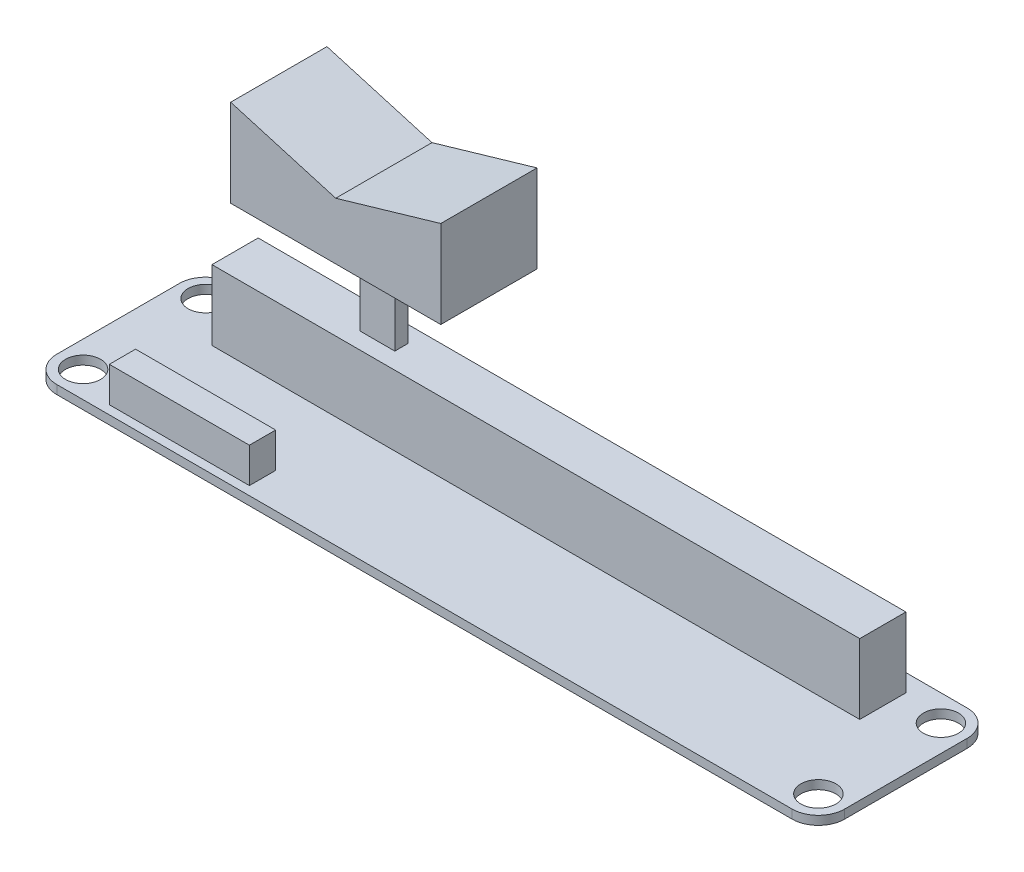
ISO-10303-21;
HEADER;
FILE_DESCRIPTION(('STEP AP214'),'2;1');
FILE_NAME('part.step','',(''),(''),'','','');
FILE_SCHEMA(('AUTOMOTIVE_DESIGN { 1 0 10303 214 1 1 1 1 }'));
ENDSEC;
DATA;
#1=APPLICATION_CONTEXT('core data for automotive mechanical design processes');
#2=APPLICATION_PROTOCOL_DEFINITION('international standard','automotive_design',2000,#1);
#3=PRODUCT_CONTEXT('',#1,'mechanical');
#4=PRODUCT('Part','Part','',(#3));
#5=PRODUCT_RELATED_PRODUCT_CATEGORY('part','',(#4));
#6=PRODUCT_DEFINITION_FORMATION('','',#4);
#7=PRODUCT_DEFINITION_CONTEXT('part definition',#1,'design');
#8=PRODUCT_DEFINITION('design','',#6,#7);
#9=PRODUCT_DEFINITION_SHAPE('','',#8);
#10=(LENGTH_UNIT() NAMED_UNIT(*) SI_UNIT(.MILLI.,.METRE.));
#11=(NAMED_UNIT(*) PLANE_ANGLE_UNIT() SI_UNIT($,.RADIAN.));
#12=(NAMED_UNIT(*) SI_UNIT($,.STERADIAN.) SOLID_ANGLE_UNIT());
#13=UNCERTAINTY_MEASURE_WITH_UNIT(LENGTH_MEASURE(1.E-05),#10,'distance_accuracy_value','');
#14=(GEOMETRIC_REPRESENTATION_CONTEXT(3) GLOBAL_UNCERTAINTY_ASSIGNED_CONTEXT((#13)) GLOBAL_UNIT_ASSIGNED_CONTEXT((#10,
#11,#12)) REPRESENTATION_CONTEXT('',''));
#15=CARTESIAN_POINT('',(0.,0.,0.));
#16=DIRECTION('',(0.,0.,1.));
#17=DIRECTION('',(1.,0.,0.));
#18=AXIS2_PLACEMENT_3D('',#15,#16,#17);
#19=CARTESIAN_POINT('',(0.,9.,0.));
#20=DIRECTION('',(0.,1.,0.));
#21=DIRECTION('',(0.,0.,1.));
#22=AXIS2_PLACEMENT_3D('',#19,#20,#21);
#23=PLANE('',#22);
#24=DIRECTION('',(0.,0.,1.));
#25=VECTOR('',#24,1.);
#26=CARTESIAN_POINT('',(8.,9.,-18.));
#27=LINE('',#26,#25);
#28=CARTESIAN_POINT('',(8.,9.,-18.));
#29=VERTEX_POINT('',#28);
#30=CARTESIAN_POINT('',(8.,9.,-12.7246609172367));
#31=VERTEX_POINT('',#30);
#32=EDGE_CURVE('E311',#29,#31,#27,.T.);
#33=ORIENTED_EDGE('',*,*,#32,.T.);
#34=DIRECTION('',(1.,0.,0.));
#35=VECTOR('',#34,1.);
#36=CARTESIAN_POINT('',(8.,9.,-12.7246609172367));
#37=LINE('',#36,#35);
#38=CARTESIAN_POINT('',(82.,9.,-12.7246609172367));
#39=VERTEX_POINT('',#38);
#40=EDGE_CURVE('E314',#31,#39,#37,.T.);
#41=ORIENTED_EDGE('',*,*,#40,.T.);
#42=DIRECTION('',(0.,0.,-1.));
#43=VECTOR('',#42,1.);
#44=CARTESIAN_POINT('',(82.,9.,-18.));
#45=LINE('',#44,#43);
#46=CARTESIAN_POINT('',(82.,9.,-18.));
#47=VERTEX_POINT('',#46);
#48=EDGE_CURVE('E317',#39,#47,#45,.T.);
#49=ORIENTED_EDGE('',*,*,#48,.T.);
#50=DIRECTION('',(-1.,0.,0.));
#51=VECTOR('',#50,1.);
#52=CARTESIAN_POINT('',(8.,9.,-18.));
#53=LINE('',#52,#51);
#54=EDGE_CURVE('E319',#47,#29,#53,.T.);
#55=ORIENTED_EDGE('',*,*,#54,.T.);
#56=EDGE_LOOP('',(#33,#41,#49,#55));
#57=FACE_BOUND('',#56,.T.);
#58=DIRECTION('',(1.,0.,0.));
#59=VECTOR('',#58,1.);
#60=CARTESIAN_POINT('',(23.,9.,-14.6123304586183));
#61=LINE('',#60,#59);
#62=CARTESIAN_POINT('',(23.,9.,-14.6123304586183));
#63=VERTEX_POINT('',#62);
#64=CARTESIAN_POINT('',(27.,9.,-14.6123304586183));
#65=VERTEX_POINT('',#64);
#66=EDGE_CURVE('E267',#63,#65,#61,.T.);
#67=ORIENTED_EDGE('',*,*,#66,.F.);
#68=DIRECTION('',(0.,0.,1.));
#69=VECTOR('',#68,1.);
#70=CARTESIAN_POINT('',(23.,9.,-16.1123304586183));
#71=LINE('',#70,#69);
#72=CARTESIAN_POINT('',(23.,9.,-16.1123304586183));
#73=VERTEX_POINT('',#72);
#74=EDGE_CURVE('E250',#73,#63,#71,.T.);
#75=ORIENTED_EDGE('',*,*,#74,.F.);
#76=DIRECTION('',(-1.,0.,0.));
#77=VECTOR('',#76,1.);
#78=CARTESIAN_POINT('',(23.,9.,-16.1123304586183));
#79=LINE('',#78,#77);
#80=CARTESIAN_POINT('',(27.,9.,-16.1123304586183));
#81=VERTEX_POINT('',#80);
#82=EDGE_CURVE('E255',#81,#73,#79,.T.);
#83=ORIENTED_EDGE('',*,*,#82,.F.);
#84=DIRECTION('',(0.,0.,-1.));
#85=VECTOR('',#84,1.);
#86=CARTESIAN_POINT('',(27.,9.,-16.1123304586183));
#87=LINE('',#86,#85);
#88=EDGE_CURVE('E269',#65,#81,#87,.T.);
#89=ORIENTED_EDGE('',*,*,#88,.F.);
#90=EDGE_LOOP('',(#67,#75,#83,#89));
#91=FACE_BOUND('',#90,.T.);
#92=ADVANCED_FACE('F35',(#57,#91),#23,.T.);
#93=CARTESIAN_POINT('',(0.,1.,0.));
#94=DIRECTION('',(0.,-1.,0.));
#95=DIRECTION('',(0.,0.,-1.));
#96=AXIS2_PLACEMENT_3D('',#93,#94,#95);
#97=PLANE('',#96);
#98=DIRECTION('',(0.,0.,1.));
#99=VECTOR('',#98,1.);
#100=CARTESIAN_POINT('',(8.,1.,-18.));
#101=LINE('',#100,#99);
#102=CARTESIAN_POINT('',(8.,1.,-18.));
#103=VERTEX_POINT('',#102);
#104=CARTESIAN_POINT('',(8.,1.,-12.7246609172367));
#105=VERTEX_POINT('',#104);
#106=EDGE_CURVE('E310',#103,#105,#101,.T.);
#107=ORIENTED_EDGE('',*,*,#106,.F.);
#108=DIRECTION('',(-1.,0.,0.));
#109=VECTOR('',#108,1.);
#110=CARTESIAN_POINT('',(8.,1.,-18.));
#111=LINE('',#110,#109);
#112=CARTESIAN_POINT('',(82.,1.,-18.));
#113=VERTEX_POINT('',#112);
#114=EDGE_CURVE('E315',#113,#103,#111,.T.);
#115=ORIENTED_EDGE('',*,*,#114,.F.);
#116=DIRECTION('',(0.,0.,-1.));
#117=VECTOR('',#116,1.);
#118=CARTESIAN_POINT('',(82.,1.,-18.));
#119=LINE('',#118,#117);
#120=CARTESIAN_POINT('',(82.,1.,-12.7246609172367));
#121=VERTEX_POINT('',#120);
#122=EDGE_CURVE('E327',#121,#113,#119,.T.);
#123=ORIENTED_EDGE('',*,*,#122,.F.);
#124=DIRECTION('',(1.,0.,0.));
#125=VECTOR('',#124,1.);
#126=CARTESIAN_POINT('',(8.,1.,-12.7246609172367));
#127=LINE('',#126,#125);
#128=EDGE_CURVE('E324',#105,#121,#127,.T.);
#129=ORIENTED_EDGE('',*,*,#128,.F.);
#130=EDGE_LOOP('',(#107,#115,#123,#129));
#131=FACE_BOUND('',#130,.T.);
#132=CARTESIAN_POINT('',(87.,1.,-16.9999999999999));
#133=DIRECTION('',(0.,1.,0.));
#134=DIRECTION('',(0.,0.,-1.));
#135=AXIS2_PLACEMENT_3D('',#132,#133,#134);
#136=CIRCLE('',#135,1.99999999999999);
#137=CARTESIAN_POINT('',(87.,1.,-18.9999999999999));
#138=VERTEX_POINT('',#137);
#139=EDGE_CURVE('E348',#138,#138,#136,.T.);
#140=ORIENTED_EDGE('',*,*,#139,.F.);
#141=EDGE_LOOP('',(#140));
#142=FACE_BOUND('',#141,.T.);
#143=CARTESIAN_POINT('',(87.,1.,-3.00000000000012));
#144=DIRECTION('',(0.,1.,0.));
#145=DIRECTION('',(0.,0.,1.));
#146=AXIS2_PLACEMENT_3D('',#143,#144,#145);
#147=CIRCLE('',#146,1.99999999999999);
#148=CARTESIAN_POINT('',(87.,1.,-1.00000000000013));
#149=VERTEX_POINT('',#148);
#150=EDGE_CURVE('E354',#149,#149,#147,.T.);
#151=ORIENTED_EDGE('',*,*,#150,.F.);
#152=EDGE_LOOP('',(#151));
#153=FACE_BOUND('',#152,.T.);
#154=CARTESIAN_POINT('',(3.,1.,-3.));
#155=DIRECTION('',(0.,1.,0.));
#156=DIRECTION('',(0.,0.,-1.));
#157=AXIS2_PLACEMENT_3D('',#154,#155,#156);
#158=CIRCLE('',#157,2.);
#159=CARTESIAN_POINT('',(3.,1.,-5.));
#160=VERTEX_POINT('',#159);
#161=EDGE_CURVE('E343',#160,#160,#158,.T.);
#162=ORIENTED_EDGE('',*,*,#161,.F.);
#163=EDGE_LOOP('',(#162));
#164=FACE_BOUND('',#163,.T.);
#165=CARTESIAN_POINT('',(3.,1.,-17.));
#166=DIRECTION('',(0.,1.,0.));
#167=DIRECTION('',(0.,0.,1.));
#168=AXIS2_PLACEMENT_3D('',#165,#166,#167);
#169=CIRCLE('',#168,2.);
#170=CARTESIAN_POINT('',(3.,1.,-15.));
#171=VERTEX_POINT('',#170);
#172=EDGE_CURVE('E347',#171,#171,#169,.T.);
#173=ORIENTED_EDGE('',*,*,#172,.F.);
#174=EDGE_LOOP('',(#173));
#175=FACE_BOUND('',#174,.T.);
#176=DIRECTION('',(0.,0.,-1.));
#177=VECTOR('',#176,1.);
#178=CARTESIAN_POINT('',(90.,1.,0.));
#179=LINE('',#178,#177);
#180=CARTESIAN_POINT('',(90.,1.,-3.));
#181=VERTEX_POINT('',#180);
#182=CARTESIAN_POINT('',(90.,1.,-17.));
#183=VERTEX_POINT('',#182);
#184=EDGE_CURVE('E375',#181,#183,#179,.T.);
#185=ORIENTED_EDGE('',*,*,#184,.T.);
#186=CARTESIAN_POINT('',(87.,1.,-17.));
#187=DIRECTION('',(0.,-1.,0.));
#188=DIRECTION('',(0.,0.,-1.));
#189=AXIS2_PLACEMENT_3D('',#186,#187,#188);
#190=CIRCLE('',#189,3.);
#191=CARTESIAN_POINT('',(87.,1.,-20.));
#192=VERTEX_POINT('',#191);
#193=EDGE_CURVE('E415',#183,#192,#190,.F.);
#194=ORIENTED_EDGE('',*,*,#193,.T.);
#195=DIRECTION('',(-1.,0.,0.));
#196=VECTOR('',#195,1.);
#197=CARTESIAN_POINT('',(0.,1.,-20.));
#198=LINE('',#197,#196);
#199=CARTESIAN_POINT('',(3.,1.,-20.));
#200=VERTEX_POINT('',#199);
#201=EDGE_CURVE('E378',#192,#200,#198,.T.);
#202=ORIENTED_EDGE('',*,*,#201,.T.);
#203=CARTESIAN_POINT('',(3.,1.,-17.));
#204=DIRECTION('',(0.,-1.,0.));
#205=DIRECTION('',(0.,0.,-1.));
#206=AXIS2_PLACEMENT_3D('',#203,#204,#205);
#207=CIRCLE('',#206,3.);
#208=CARTESIAN_POINT('',(0.,1.,-17.));
#209=VERTEX_POINT('',#208);
#210=EDGE_CURVE('E409',#200,#209,#207,.F.);
#211=ORIENTED_EDGE('',*,*,#210,.T.);
#212=DIRECTION('',(0.,0.,1.));
#213=VECTOR('',#212,1.);
#214=CARTESIAN_POINT('',(0.,1.,0.));
#215=LINE('',#214,#213);
#216=CARTESIAN_POINT('',(0.,1.,-3.));
#217=VERTEX_POINT('',#216);
#218=EDGE_CURVE('E368',#209,#217,#215,.T.);
#219=ORIENTED_EDGE('',*,*,#218,.T.);
#220=CARTESIAN_POINT('',(3.,1.,-3.));
#221=DIRECTION('',(0.,-1.,0.));
#222=DIRECTION('',(0.,0.,-1.));
#223=AXIS2_PLACEMENT_3D('',#220,#221,#222);
#224=CIRCLE('',#223,3.);
#225=CARTESIAN_POINT('',(3.,1.,0.));
#226=VERTEX_POINT('',#225);
#227=EDGE_CURVE('E411',#217,#226,#224,.F.);
#228=ORIENTED_EDGE('',*,*,#227,.T.);
#229=DIRECTION('',(1.,0.,0.));
#230=VECTOR('',#229,1.);
#231=CARTESIAN_POINT('',(0.,1.,0.));
#232=LINE('',#231,#230);
#233=CARTESIAN_POINT('',(87.,1.,0.));
#234=VERTEX_POINT('',#233);
#235=EDGE_CURVE('E371',#226,#234,#232,.T.);
#236=ORIENTED_EDGE('',*,*,#235,.T.);
#237=CARTESIAN_POINT('',(87.,1.,-3.));
#238=DIRECTION('',(0.,-1.,0.));
#239=DIRECTION('',(0.,0.,-1.));
#240=AXIS2_PLACEMENT_3D('',#237,#238,#239);
#241=CIRCLE('',#240,3.);
#242=EDGE_CURVE('E413',#234,#181,#241,.F.);
#243=ORIENTED_EDGE('',*,*,#242,.T.);
#244=EDGE_LOOP('',(#185,#194,#202,#211,#219,#228,#236,#243));
#245=FACE_BOUND('',#244,.T.);
#246=DIRECTION('',(0.,0.,1.));
#247=VECTOR('',#246,1.);
#248=CARTESIAN_POINT('',(8.,1.,-4.));
#249=LINE('',#248,#247);
#250=CARTESIAN_POINT('',(8.,1.,-4.));
#251=VERTEX_POINT('',#250);
#252=CARTESIAN_POINT('',(8.,1.,-1.));
#253=VERTEX_POINT('',#252);
#254=EDGE_CURVE('E280',#251,#253,#249,.T.);
#255=ORIENTED_EDGE('',*,*,#254,.F.);
#256=DIRECTION('',(-1.,0.,0.));
#257=VECTOR('',#256,1.);
#258=CARTESIAN_POINT('',(8.,1.,-4.));
#259=LINE('',#258,#257);
#260=CARTESIAN_POINT('',(24.,1.,-4.));
#261=VERTEX_POINT('',#260);
#262=EDGE_CURVE('E285',#261,#251,#259,.T.);
#263=ORIENTED_EDGE('',*,*,#262,.F.);
#264=DIRECTION('',(0.,0.,-1.));
#265=VECTOR('',#264,1.);
#266=CARTESIAN_POINT('',(24.,1.,-4.));
#267=LINE('',#266,#265);
#268=CARTESIAN_POINT('',(24.,1.,-1.));
#269=VERTEX_POINT('',#268);
#270=EDGE_CURVE('E295',#269,#261,#267,.T.);
#271=ORIENTED_EDGE('',*,*,#270,.F.);
#272=DIRECTION('',(1.,0.,0.));
#273=VECTOR('',#272,1.);
#274=CARTESIAN_POINT('',(8.,1.,-1.));
#275=LINE('',#274,#273);
#276=EDGE_CURVE('E58',#253,#269,#275,.T.);
#277=ORIENTED_EDGE('',*,*,#276,.F.);
#278=EDGE_LOOP('',(#255,#263,#271,#277));
#279=FACE_BOUND('',#278,.T.);
#280=ADVANCED_FACE('F444',(#131,#142,#153,#164,#175,#245,#279),#97,.F.);
#281=CARTESIAN_POINT('',(0.,1.,0.));
#282=DIRECTION('',(1.,0.,0.));
#283=DIRECTION('',(0.,0.,-1.));
#284=AXIS2_PLACEMENT_3D('',#281,#282,#283);
#285=PLANE('',#284);
#286=DIRECTION('',(0.,0.,1.));
#287=VECTOR('',#286,1.);
#288=CARTESIAN_POINT('',(0.,0.,0.));
#289=LINE('',#288,#287);
#290=CARTESIAN_POINT('',(0.,0.,-17.));
#291=VERTEX_POINT('',#290);
#292=CARTESIAN_POINT('',(0.,0.,-3.));
#293=VERTEX_POINT('',#292);
#294=EDGE_CURVE('E365',#291,#293,#289,.T.);
#295=ORIENTED_EDGE('',*,*,#294,.T.);
#296=DIRECTION('',(0.,-1.,0.));
#297=VECTOR('',#296,1.);
#298=CARTESIAN_POINT('',(0.,1.,-3.));
#299=LINE('',#298,#297);
#300=EDGE_CURVE('E11',#293,#217,#299,.F.);
#301=ORIENTED_EDGE('',*,*,#300,.T.);
#302=ORIENTED_EDGE('',*,*,#218,.F.);
#303=DIRECTION('',(0.,-1.,0.));
#304=VECTOR('',#303,1.);
#305=CARTESIAN_POINT('',(0.,1.,-17.));
#306=LINE('',#305,#304);
#307=EDGE_CURVE('E43',#209,#291,#306,.T.);
#308=ORIENTED_EDGE('',*,*,#307,.T.);
#309=EDGE_LOOP('',(#295,#301,#302,#308));
#310=FACE_BOUND('',#309,.T.);
#311=ADVANCED_FACE('F426',(#310),#285,.F.);
#312=CARTESIAN_POINT('',(0.,1.,0.));
#313=DIRECTION('',(0.,0.,-1.));
#314=DIRECTION('',(-1.,0.,0.));
#315=AXIS2_PLACEMENT_3D('',#312,#313,#314);
#316=PLANE('',#315);
#317=DIRECTION('',(1.,0.,0.));
#318=VECTOR('',#317,1.);
#319=CARTESIAN_POINT('',(0.,0.,0.));
#320=LINE('',#319,#318);
#321=CARTESIAN_POINT('',(3.,0.,0.));
#322=VERTEX_POINT('',#321);
#323=CARTESIAN_POINT('',(87.,0.,0.));
#324=VERTEX_POINT('',#323);
#325=EDGE_CURVE('E384',#322,#324,#320,.T.);
#326=ORIENTED_EDGE('',*,*,#325,.T.);
#327=DIRECTION('',(0.,-1.,0.));
#328=VECTOR('',#327,1.);
#329=CARTESIAN_POINT('',(87.,1.,0.));
#330=LINE('',#329,#328);
#331=EDGE_CURVE('E420',#324,#234,#330,.F.);
#332=ORIENTED_EDGE('',*,*,#331,.T.);
#333=ORIENTED_EDGE('',*,*,#235,.F.);
#334=DIRECTION('',(0.,-1.,0.));
#335=VECTOR('',#334,1.);
#336=CARTESIAN_POINT('',(3.,1.,0.));
#337=LINE('',#336,#335);
#338=EDGE_CURVE('E417',#226,#322,#337,.T.);
#339=ORIENTED_EDGE('',*,*,#338,.T.);
#340=EDGE_LOOP('',(#326,#332,#333,#339));
#341=FACE_BOUND('',#340,.T.);
#342=ADVANCED_FACE('F440',(#341),#316,.F.);
#343=CARTESIAN_POINT('',(90.,1.,0.));
#344=DIRECTION('',(-1.,0.,0.));
#345=DIRECTION('',(0.,0.,1.));
#346=AXIS2_PLACEMENT_3D('',#343,#344,#345);
#347=PLANE('',#346);
#348=DIRECTION('',(0.,0.,-1.));
#349=VECTOR('',#348,1.);
#350=CARTESIAN_POINT('',(90.,0.,0.));
#351=LINE('',#350,#349);
#352=CARTESIAN_POINT('',(90.,0.,-3.));
#353=VERTEX_POINT('',#352);
#354=CARTESIAN_POINT('',(90.,0.,-17.));
#355=VERTEX_POINT('',#354);
#356=EDGE_CURVE('E387',#353,#355,#351,.T.);
#357=ORIENTED_EDGE('',*,*,#356,.T.);
#358=DIRECTION('',(0.,-1.,0.));
#359=VECTOR('',#358,1.);
#360=CARTESIAN_POINT('',(90.,1.,-17.));
#361=LINE('',#360,#359);
#362=EDGE_CURVE('E407',#355,#183,#361,.F.);
#363=ORIENTED_EDGE('',*,*,#362,.T.);
#364=ORIENTED_EDGE('',*,*,#184,.F.);
#365=DIRECTION('',(0.,-1.,0.));
#366=VECTOR('',#365,1.);
#367=CARTESIAN_POINT('',(90.,1.,-3.));
#368=LINE('',#367,#366);
#369=EDGE_CURVE('E404',#181,#353,#368,.T.);
#370=ORIENTED_EDGE('',*,*,#369,.T.);
#371=EDGE_LOOP('',(#357,#363,#364,#370));
#372=FACE_BOUND('',#371,.T.);
#373=ADVANCED_FACE('F451',(#372),#347,.F.);
#374=CARTESIAN_POINT('',(0.,1.,-20.));
#375=DIRECTION('',(0.,0.,1.));
#376=DIRECTION('',(1.,0.,0.));
#377=AXIS2_PLACEMENT_3D('',#374,#375,#376);
#378=PLANE('',#377);
#379=ORIENTED_EDGE('',*,*,#201,.F.);
#380=DIRECTION('',(0.,-1.,0.));
#381=VECTOR('',#380,1.);
#382=CARTESIAN_POINT('',(87.,1.,-20.));
#383=LINE('',#382,#381);
#384=CARTESIAN_POINT('',(87.,0.,-20.));
#385=VERTEX_POINT('',#384);
#386=EDGE_CURVE('E393',#192,#385,#383,.T.);
#387=ORIENTED_EDGE('',*,*,#386,.T.);
#388=DIRECTION('',(-1.,0.,0.));
#389=VECTOR('',#388,1.);
#390=CARTESIAN_POINT('',(0.,0.,-20.));
#391=LINE('',#390,#389);
#392=CARTESIAN_POINT('',(3.,0.,-20.));
#393=VERTEX_POINT('',#392);
#394=EDGE_CURVE('E372',#385,#393,#391,.T.);
#395=ORIENTED_EDGE('',*,*,#394,.T.);
#396=DIRECTION('',(0.,-1.,0.));
#397=VECTOR('',#396,1.);
#398=CARTESIAN_POINT('',(3.,1.,-20.));
#399=LINE('',#398,#397);
#400=EDGE_CURVE('E381',#393,#200,#399,.F.);
#401=ORIENTED_EDGE('',*,*,#400,.T.);
#402=EDGE_LOOP('',(#379,#387,#395,#401));
#403=FACE_BOUND('',#402,.T.);
#404=ADVANCED_FACE('F459',(#403),#378,.F.);
#405=CARTESIAN_POINT('',(0.,0.,0.));
#406=DIRECTION('',(0.,-1.,0.));
#407=DIRECTION('',(0.,0.,-1.));
#408=AXIS2_PLACEMENT_3D('',#405,#406,#407);
#409=PLANE('',#408);
#410=CARTESIAN_POINT('',(87.,0.,-16.9999999999999));
#411=DIRECTION('',(0.,1.,0.));
#412=DIRECTION('',(0.,0.,-1.));
#413=AXIS2_PLACEMENT_3D('',#410,#411,#412);
#414=CIRCLE('',#413,1.99999999999999);
#415=CARTESIAN_POINT('',(87.,0.,-18.9999999999999));
#416=VERTEX_POINT('',#415);
#417=EDGE_CURVE('E344',#416,#416,#414,.T.);
#418=ORIENTED_EDGE('',*,*,#417,.T.);
#419=EDGE_LOOP('',(#418));
#420=FACE_BOUND('',#419,.T.);
#421=CARTESIAN_POINT('',(87.,0.,-3.00000000000012));
#422=DIRECTION('',(0.,1.,0.));
#423=DIRECTION('',(0.,0.,1.));
#424=AXIS2_PLACEMENT_3D('',#421,#422,#423);
#425=CIRCLE('',#424,1.99999999999999);
#426=CARTESIAN_POINT('',(87.,0.,-1.00000000000013));
#427=VERTEX_POINT('',#426);
#428=EDGE_CURVE('E351',#427,#427,#425,.T.);
#429=ORIENTED_EDGE('',*,*,#428,.T.);
#430=EDGE_LOOP('',(#429));
#431=FACE_BOUND('',#430,.T.);
#432=CARTESIAN_POINT('',(3.,0.,-3.));
#433=DIRECTION('',(0.,1.,0.));
#434=DIRECTION('',(0.,0.,-1.));
#435=AXIS2_PLACEMENT_3D('',#432,#433,#434);
#436=CIRCLE('',#435,2.);
#437=CARTESIAN_POINT('',(3.,0.,-5.));
#438=VERTEX_POINT('',#437);
#439=EDGE_CURVE('E357',#438,#438,#436,.T.);
#440=ORIENTED_EDGE('',*,*,#439,.T.);
#441=EDGE_LOOP('',(#440));
#442=FACE_BOUND('',#441,.T.);
#443=CARTESIAN_POINT('',(3.,0.,-17.));
#444=DIRECTION('',(0.,1.,0.));
#445=DIRECTION('',(0.,0.,1.));
#446=AXIS2_PLACEMENT_3D('',#443,#444,#445);
#447=CIRCLE('',#446,2.);
#448=CARTESIAN_POINT('',(3.,0.,-15.));
#449=VERTEX_POINT('',#448);
#450=EDGE_CURVE('E362',#449,#449,#447,.T.);
#451=ORIENTED_EDGE('',*,*,#450,.T.);
#452=EDGE_LOOP('',(#451));
#453=FACE_BOUND('',#452,.T.);
#454=ORIENTED_EDGE('',*,*,#394,.F.);
#455=CARTESIAN_POINT('',(87.,0.,-17.));
#456=DIRECTION('',(0.,-1.,0.));
#457=DIRECTION('',(0.,0.,-1.));
#458=AXIS2_PLACEMENT_3D('',#455,#456,#457);
#459=CIRCLE('',#458,3.);
#460=EDGE_CURVE('E402',#385,#355,#459,.T.);
#461=ORIENTED_EDGE('',*,*,#460,.T.);
#462=ORIENTED_EDGE('',*,*,#356,.F.);
#463=CARTESIAN_POINT('',(87.,0.,-3.));
#464=DIRECTION('',(0.,-1.,0.));
#465=DIRECTION('',(0.,0.,-1.));
#466=AXIS2_PLACEMENT_3D('',#463,#464,#465);
#467=CIRCLE('',#466,3.);
#468=EDGE_CURVE('E400',#353,#324,#467,.T.);
#469=ORIENTED_EDGE('',*,*,#468,.T.);
#470=ORIENTED_EDGE('',*,*,#325,.F.);
#471=CARTESIAN_POINT('',(3.,0.,-3.));
#472=DIRECTION('',(0.,-1.,0.));
#473=DIRECTION('',(0.,0.,-1.));
#474=AXIS2_PLACEMENT_3D('',#471,#472,#473);
#475=CIRCLE('',#474,3.);
#476=EDGE_CURVE('E398',#322,#293,#475,.T.);
#477=ORIENTED_EDGE('',*,*,#476,.T.);
#478=ORIENTED_EDGE('',*,*,#294,.F.);
#479=CARTESIAN_POINT('',(3.,0.,-17.));
#480=DIRECTION('',(0.,-1.,0.));
#481=DIRECTION('',(0.,0.,-1.));
#482=AXIS2_PLACEMENT_3D('',#479,#480,#481);
#483=CIRCLE('',#482,3.);
#484=EDGE_CURVE('E396',#291,#393,#483,.T.);
#485=ORIENTED_EDGE('',*,*,#484,.T.);
#486=EDGE_LOOP('',(#454,#461,#462,#469,#470,#477,#478,#485));
#487=FACE_BOUND('',#486,.T.);
#488=ADVANCED_FACE('F432',(#420,#431,#442,#453,#487),#409,.T.);
#489=CARTESIAN_POINT('',(3.,0.,-17.));
#490=DIRECTION('',(0.,1.,0.));
#491=DIRECTION('',(0.,0.,1.));
#492=AXIS2_PLACEMENT_3D('',#489,#490,#491);
#493=CYLINDRICAL_SURFACE('',#492,2.);
#494=ORIENTED_EDGE('',*,*,#450,.F.);
#495=EDGE_LOOP('',(#494));
#496=FACE_BOUND('',#495,.T.);
#497=ORIENTED_EDGE('',*,*,#172,.T.);
#498=EDGE_LOOP('',(#497));
#499=FACE_BOUND('',#498,.T.);
#500=ADVANCED_FACE('F505',(#496,#499),#493,.F.);
#501=CARTESIAN_POINT('',(3.,0.,-3.));
#502=DIRECTION('',(0.,1.,0.));
#503=DIRECTION('',(0.,0.,1.));
#504=AXIS2_PLACEMENT_3D('',#501,#502,#503);
#505=CYLINDRICAL_SURFACE('',#504,2.);
#506=ORIENTED_EDGE('',*,*,#439,.F.);
#507=EDGE_LOOP('',(#506));
#508=FACE_BOUND('',#507,.T.);
#509=ORIENTED_EDGE('',*,*,#161,.T.);
#510=EDGE_LOOP('',(#509));
#511=FACE_BOUND('',#510,.T.);
#512=ADVANCED_FACE('F501',(#508,#511),#505,.F.);
#513=CARTESIAN_POINT('',(87.,0.,-3.00000000000012));
#514=DIRECTION('',(0.,1.,0.));
#515=DIRECTION('',(0.,0.,1.));
#516=AXIS2_PLACEMENT_3D('',#513,#514,#515);
#517=CYLINDRICAL_SURFACE('',#516,1.99999999999999);
#518=ORIENTED_EDGE('',*,*,#428,.F.);
#519=EDGE_LOOP('',(#518));
#520=FACE_BOUND('',#519,.T.);
#521=ORIENTED_EDGE('',*,*,#150,.T.);
#522=EDGE_LOOP('',(#521));
#523=FACE_BOUND('',#522,.T.);
#524=ADVANCED_FACE('F497',(#520,#523),#517,.F.);
#525=CARTESIAN_POINT('',(87.,0.,-16.9999999999999));
#526=DIRECTION('',(0.,1.,0.));
#527=DIRECTION('',(0.,0.,1.));
#528=AXIS2_PLACEMENT_3D('',#525,#526,#527);
#529=CYLINDRICAL_SURFACE('',#528,1.99999999999999);
#530=ORIENTED_EDGE('',*,*,#417,.F.);
#531=EDGE_LOOP('',(#530));
#532=FACE_BOUND('',#531,.T.);
#533=ORIENTED_EDGE('',*,*,#139,.T.);
#534=EDGE_LOOP('',(#533));
#535=FACE_BOUND('',#534,.T.);
#536=ADVANCED_FACE('F494',(#532,#535),#529,.F.);
#537=CARTESIAN_POINT('',(87.,1.,-17.));
#538=DIRECTION('',(0.,-1.,0.));
#539=DIRECTION('',(0.,0.,-1.));
#540=AXIS2_PLACEMENT_3D('',#537,#538,#539);
#541=CYLINDRICAL_SURFACE('',#540,3.);
#542=ORIENTED_EDGE('',*,*,#193,.F.);
#543=ORIENTED_EDGE('',*,*,#362,.F.);
#544=ORIENTED_EDGE('',*,*,#460,.F.);
#545=ORIENTED_EDGE('',*,*,#386,.F.);
#546=EDGE_LOOP('',(#542,#543,#544,#545));
#547=FACE_BOUND('',#546,.T.);
#548=ADVANCED_FACE('F456',(#547),#541,.T.);
#549=CARTESIAN_POINT('',(87.,1.,-3.));
#550=DIRECTION('',(0.,-1.,0.));
#551=DIRECTION('',(0.,0.,-1.));
#552=AXIS2_PLACEMENT_3D('',#549,#550,#551);
#553=CYLINDRICAL_SURFACE('',#552,3.);
#554=ORIENTED_EDGE('',*,*,#242,.F.);
#555=ORIENTED_EDGE('',*,*,#331,.F.);
#556=ORIENTED_EDGE('',*,*,#468,.F.);
#557=ORIENTED_EDGE('',*,*,#369,.F.);
#558=EDGE_LOOP('',(#554,#555,#556,#557));
#559=FACE_BOUND('',#558,.T.);
#560=ADVANCED_FACE('F448',(#559),#553,.T.);
#561=CARTESIAN_POINT('',(3.,1.,-3.));
#562=DIRECTION('',(0.,-1.,0.));
#563=DIRECTION('',(0.,0.,-1.));
#564=AXIS2_PLACEMENT_3D('',#561,#562,#563);
#565=CYLINDRICAL_SURFACE('',#564,3.);
#566=ORIENTED_EDGE('',*,*,#227,.F.);
#567=ORIENTED_EDGE('',*,*,#300,.F.);
#568=ORIENTED_EDGE('',*,*,#476,.F.);
#569=ORIENTED_EDGE('',*,*,#338,.F.);
#570=EDGE_LOOP('',(#566,#567,#568,#569));
#571=FACE_BOUND('',#570,.T.);
#572=ADVANCED_FACE('F437',(#571),#565,.T.);
#573=CARTESIAN_POINT('',(3.,1.,-17.));
#574=DIRECTION('',(0.,-1.,0.));
#575=DIRECTION('',(0.,0.,-1.));
#576=AXIS2_PLACEMENT_3D('',#573,#574,#575);
#577=CYLINDRICAL_SURFACE('',#576,3.);
#578=ORIENTED_EDGE('',*,*,#210,.F.);
#579=ORIENTED_EDGE('',*,*,#400,.F.);
#580=ORIENTED_EDGE('',*,*,#484,.F.);
#581=ORIENTED_EDGE('',*,*,#307,.F.);
#582=EDGE_LOOP('',(#578,#579,#580,#581));
#583=FACE_BOUND('',#582,.T.);
#584=ADVANCED_FACE('F37',(#583),#577,.T.);
#585=CARTESIAN_POINT('',(8.,9.,-18.));
#586=DIRECTION('',(1.,0.,0.));
#587=DIRECTION('',(0.,0.,-1.));
#588=AXIS2_PLACEMENT_3D('',#585,#586,#587);
#589=PLANE('',#588);
#590=ORIENTED_EDGE('',*,*,#106,.T.);
#591=DIRECTION('',(0.,-1.,0.));
#592=VECTOR('',#591,1.);
#593=CARTESIAN_POINT('',(8.,9.,-12.7246609172367));
#594=LINE('',#593,#592);
#595=EDGE_CURVE('E340',#31,#105,#594,.T.);
#596=ORIENTED_EDGE('',*,*,#595,.F.);
#597=ORIENTED_EDGE('',*,*,#32,.F.);
#598=DIRECTION('',(0.,-1.,0.));
#599=VECTOR('',#598,1.);
#600=CARTESIAN_POINT('',(8.,9.,-18.));
#601=LINE('',#600,#599);
#602=EDGE_CURVE('E321',#29,#103,#601,.T.);
#603=ORIENTED_EDGE('',*,*,#602,.T.);
#604=EDGE_LOOP('',(#590,#596,#597,#603));
#605=FACE_BOUND('',#604,.T.);
#606=ADVANCED_FACE('F462',(#605),#589,.F.);
#607=CARTESIAN_POINT('',(8.,9.,-12.7246609172367));
#608=DIRECTION('',(0.,0.,-1.));
#609=DIRECTION('',(-1.,0.,0.));
#610=AXIS2_PLACEMENT_3D('',#607,#608,#609);
#611=PLANE('',#610);
#612=ORIENTED_EDGE('',*,*,#128,.T.);
#613=DIRECTION('',(0.,-1.,0.));
#614=VECTOR('',#613,1.);
#615=CARTESIAN_POINT('',(82.,9.,-12.7246609172367));
#616=LINE('',#615,#614);
#617=EDGE_CURVE('E337',#39,#121,#616,.T.);
#618=ORIENTED_EDGE('',*,*,#617,.F.);
#619=ORIENTED_EDGE('',*,*,#40,.F.);
#620=ORIENTED_EDGE('',*,*,#595,.T.);
#621=EDGE_LOOP('',(#612,#618,#619,#620));
#622=FACE_BOUND('',#621,.T.);
#623=ADVANCED_FACE('F467',(#622),#611,.F.);
#624=CARTESIAN_POINT('',(82.,9.,-18.));
#625=DIRECTION('',(-1.,0.,0.));
#626=DIRECTION('',(0.,0.,1.));
#627=AXIS2_PLACEMENT_3D('',#624,#625,#626);
#628=PLANE('',#627);
#629=ORIENTED_EDGE('',*,*,#122,.T.);
#630=DIRECTION('',(0.,-1.,0.));
#631=VECTOR('',#630,1.);
#632=CARTESIAN_POINT('',(82.,9.,-18.));
#633=LINE('',#632,#631);
#634=EDGE_CURVE('E334',#47,#113,#633,.T.);
#635=ORIENTED_EDGE('',*,*,#634,.F.);
#636=ORIENTED_EDGE('',*,*,#48,.F.);
#637=ORIENTED_EDGE('',*,*,#617,.T.);
#638=EDGE_LOOP('',(#629,#635,#636,#637));
#639=FACE_BOUND('',#638,.T.);
#640=ADVANCED_FACE('F486',(#639),#628,.F.);
#641=CARTESIAN_POINT('',(8.,9.,-18.));
#642=DIRECTION('',(0.,0.,1.));
#643=DIRECTION('',(1.,0.,0.));
#644=AXIS2_PLACEMENT_3D('',#641,#642,#643);
#645=PLANE('',#644);
#646=ORIENTED_EDGE('',*,*,#114,.T.);
#647=ORIENTED_EDGE('',*,*,#602,.F.);
#648=ORIENTED_EDGE('',*,*,#54,.F.);
#649=ORIENTED_EDGE('',*,*,#634,.T.);
#650=EDGE_LOOP('',(#646,#647,#648,#649));
#651=FACE_BOUND('',#650,.T.);
#652=ADVANCED_FACE('F483',(#651),#645,.F.);
#653=CARTESIAN_POINT('',(8.,5.,-4.));
#654=DIRECTION('',(1.,0.,0.));
#655=DIRECTION('',(0.,0.,-1.));
#656=AXIS2_PLACEMENT_3D('',#653,#654,#655);
#657=PLANE('',#656);
#658=ORIENTED_EDGE('',*,*,#254,.T.);
#659=DIRECTION('',(0.,-1.,0.));
#660=VECTOR('',#659,1.);
#661=CARTESIAN_POINT('',(8.,5.,-1.));
#662=LINE('',#661,#660);
#663=CARTESIAN_POINT('',(8.,5.,-1.));
#664=VERTEX_POINT('',#663);
#665=EDGE_CURVE('E308',#664,#253,#662,.T.);
#666=ORIENTED_EDGE('',*,*,#665,.F.);
#667=DIRECTION('',(0.,0.,1.));
#668=VECTOR('',#667,1.);
#669=CARTESIAN_POINT('',(8.,5.,-4.));
#670=LINE('',#669,#668);
#671=CARTESIAN_POINT('',(8.,5.,-4.));
#672=VERTEX_POINT('',#671);
#673=EDGE_CURVE('E281',#672,#664,#670,.T.);
#674=ORIENTED_EDGE('',*,*,#673,.F.);
#675=DIRECTION('',(0.,-1.,0.));
#676=VECTOR('',#675,1.);
#677=CARTESIAN_POINT('',(8.,5.,-4.));
#678=LINE('',#677,#676);
#679=EDGE_CURVE('E291',#672,#251,#678,.T.);
#680=ORIENTED_EDGE('',*,*,#679,.T.);
#681=EDGE_LOOP('',(#658,#666,#674,#680));
#682=FACE_BOUND('',#681,.T.);
#683=ADVANCED_FACE('F481',(#682),#657,.F.);
#684=CARTESIAN_POINT('',(8.,5.,-1.));
#685=DIRECTION('',(0.,0.,-1.));
#686=DIRECTION('',(-1.,0.,0.));
#687=AXIS2_PLACEMENT_3D('',#684,#685,#686);
#688=PLANE('',#687);
#689=ORIENTED_EDGE('',*,*,#276,.T.);
#690=DIRECTION('',(0.,-1.,0.));
#691=VECTOR('',#690,1.);
#692=CARTESIAN_POINT('',(24.,5.,-1.));
#693=LINE('',#692,#691);
#694=CARTESIAN_POINT('',(24.,5.,-1.));
#695=VERTEX_POINT('',#694);
#696=EDGE_CURVE('E305',#695,#269,#693,.T.);
#697=ORIENTED_EDGE('',*,*,#696,.F.);
#698=DIRECTION('',(1.,0.,0.));
#699=VECTOR('',#698,1.);
#700=CARTESIAN_POINT('',(8.,5.,-1.));
#701=LINE('',#700,#699);
#702=EDGE_CURVE('E284',#664,#695,#701,.T.);
#703=ORIENTED_EDGE('',*,*,#702,.F.);
#704=ORIENTED_EDGE('',*,*,#665,.T.);
#705=EDGE_LOOP('',(#689,#697,#703,#704));
#706=FACE_BOUND('',#705,.T.);
#707=ADVANCED_FACE('F575',(#706),#688,.F.);
#708=CARTESIAN_POINT('',(24.,5.,-4.));
#709=DIRECTION('',(-1.,0.,0.));
#710=DIRECTION('',(0.,0.,1.));
#711=AXIS2_PLACEMENT_3D('',#708,#709,#710);
#712=PLANE('',#711);
#713=ORIENTED_EDGE('',*,*,#270,.T.);
#714=DIRECTION('',(0.,-1.,0.));
#715=VECTOR('',#714,1.);
#716=CARTESIAN_POINT('',(24.,5.,-4.));
#717=LINE('',#716,#715);
#718=CARTESIAN_POINT('',(24.,5.,-4.));
#719=VERTEX_POINT('',#718);
#720=EDGE_CURVE('E302',#719,#261,#717,.T.);
#721=ORIENTED_EDGE('',*,*,#720,.F.);
#722=DIRECTION('',(0.,0.,-1.));
#723=VECTOR('',#722,1.);
#724=CARTESIAN_POINT('',(24.,5.,-4.));
#725=LINE('',#724,#723);
#726=EDGE_CURVE('E287',#695,#719,#725,.T.);
#727=ORIENTED_EDGE('',*,*,#726,.F.);
#728=ORIENTED_EDGE('',*,*,#696,.T.);
#729=EDGE_LOOP('',(#713,#721,#727,#728));
#730=FACE_BOUND('',#729,.T.);
#731=ADVANCED_FACE('F584',(#730),#712,.F.);
#732=CARTESIAN_POINT('',(8.,5.,-4.));
#733=DIRECTION('',(0.,0.,1.));
#734=DIRECTION('',(1.,0.,0.));
#735=AXIS2_PLACEMENT_3D('',#732,#733,#734);
#736=PLANE('',#735);
#737=ORIENTED_EDGE('',*,*,#262,.T.);
#738=ORIENTED_EDGE('',*,*,#679,.F.);
#739=DIRECTION('',(-1.,0.,0.));
#740=VECTOR('',#739,1.);
#741=CARTESIAN_POINT('',(8.,5.,-4.));
#742=LINE('',#741,#740);
#743=EDGE_CURVE('E289',#719,#672,#742,.T.);
#744=ORIENTED_EDGE('',*,*,#743,.F.);
#745=ORIENTED_EDGE('',*,*,#720,.T.);
#746=EDGE_LOOP('',(#737,#738,#744,#745));
#747=FACE_BOUND('',#746,.T.);
#748=ADVANCED_FACE('F593',(#747),#736,.F.);
#749=CARTESIAN_POINT('',(0.,5.,0.));
#750=DIRECTION('',(0.,1.,0.));
#751=DIRECTION('',(0.,0.,1.));
#752=AXIS2_PLACEMENT_3D('',#749,#750,#751);
#753=PLANE('',#752);
#754=ORIENTED_EDGE('',*,*,#673,.T.);
#755=ORIENTED_EDGE('',*,*,#702,.T.);
#756=ORIENTED_EDGE('',*,*,#726,.T.);
#757=ORIENTED_EDGE('',*,*,#743,.T.);
#758=EDGE_LOOP('',(#754,#755,#756,#757));
#759=FACE_BOUND('',#758,.T.);
#760=ADVANCED_FACE('F603',(#759),#753,.T.);
#761=CARTESIAN_POINT('',(23.,19.,-16.1123304586183));
#762=DIRECTION('',(1.,0.,0.));
#763=DIRECTION('',(0.,0.,-1.));
#764=AXIS2_PLACEMENT_3D('',#761,#762,#763);
#765=PLANE('',#764);
#766=ORIENTED_EDGE('',*,*,#74,.T.);
#767=DIRECTION('',(0.,-1.,0.));
#768=VECTOR('',#767,1.);
#769=CARTESIAN_POINT('',(23.,19.,-14.6123304586183));
#770=LINE('',#769,#768);
#771=CARTESIAN_POINT('',(23.,19.,-14.6123304586183));
#772=VERTEX_POINT('',#771);
#773=EDGE_CURVE('E278',#772,#63,#770,.T.);
#774=ORIENTED_EDGE('',*,*,#773,.F.);
#775=DIRECTION('',(0.,0.,1.));
#776=VECTOR('',#775,1.);
#777=CARTESIAN_POINT('',(23.,19.,-16.1123304586183));
#778=LINE('',#777,#776);
#779=CARTESIAN_POINT('',(23.,19.,-16.1123304586183));
#780=VERTEX_POINT('',#779);
#781=EDGE_CURVE('E251',#780,#772,#778,.T.);
#782=ORIENTED_EDGE('',*,*,#781,.F.);
#783=DIRECTION('',(0.,-1.,0.));
#784=VECTOR('',#783,1.);
#785=CARTESIAN_POINT('',(23.,19.,-16.1123304586183));
#786=LINE('',#785,#784);
#787=EDGE_CURVE('E264',#780,#73,#786,.T.);
#788=ORIENTED_EDGE('',*,*,#787,.T.);
#789=EDGE_LOOP('',(#766,#774,#782,#788));
#790=FACE_BOUND('',#789,.T.);
#791=ADVANCED_FACE('F612',(#790),#765,.F.);
#792=CARTESIAN_POINT('',(23.,19.,-14.6123304586183));
#793=DIRECTION('',(0.,0.,-1.));
#794=DIRECTION('',(-1.,0.,0.));
#795=AXIS2_PLACEMENT_3D('',#792,#793,#794);
#796=PLANE('',#795);
#797=ORIENTED_EDGE('',*,*,#66,.T.);
#798=DIRECTION('',(0.,-1.,0.));
#799=VECTOR('',#798,1.);
#800=CARTESIAN_POINT('',(27.,19.,-14.6123304586183));
#801=LINE('',#800,#799);
#802=CARTESIAN_POINT('',(27.,19.,-14.6123304586183));
#803=VERTEX_POINT('',#802);
#804=EDGE_CURVE('E275',#803,#65,#801,.T.);
#805=ORIENTED_EDGE('',*,*,#804,.F.);
#806=DIRECTION('',(1.,0.,0.));
#807=VECTOR('',#806,1.);
#808=CARTESIAN_POINT('',(23.,19.,-14.6123304586183));
#809=LINE('',#808,#807);
#810=EDGE_CURVE('E254',#772,#803,#809,.T.);
#811=ORIENTED_EDGE('',*,*,#810,.F.);
#812=ORIENTED_EDGE('',*,*,#773,.T.);
#813=EDGE_LOOP('',(#797,#805,#811,#812));
#814=FACE_BOUND('',#813,.T.);
#815=ADVANCED_FACE('F627',(#814),#796,.F.);
#816=CARTESIAN_POINT('',(27.,19.,-16.1123304586183));
#817=DIRECTION('',(-1.,0.,0.));
#818=DIRECTION('',(0.,0.,1.));
#819=AXIS2_PLACEMENT_3D('',#816,#817,#818);
#820=PLANE('',#819);
#821=ORIENTED_EDGE('',*,*,#88,.T.);
#822=DIRECTION('',(0.,-1.,0.));
#823=VECTOR('',#822,1.);
#824=CARTESIAN_POINT('',(27.,19.,-16.1123304586183));
#825=LINE('',#824,#823);
#826=CARTESIAN_POINT('',(27.,19.,-16.1123304586183));
#827=VERTEX_POINT('',#826);
#828=EDGE_CURVE('E50',#827,#81,#825,.T.);
#829=ORIENTED_EDGE('',*,*,#828,.F.);
#830=DIRECTION('',(0.,0.,-1.));
#831=VECTOR('',#830,1.);
#832=CARTESIAN_POINT('',(27.,19.,-16.1123304586183));
#833=LINE('',#832,#831);
#834=EDGE_CURVE('E258',#803,#827,#833,.T.);
#835=ORIENTED_EDGE('',*,*,#834,.F.);
#836=ORIENTED_EDGE('',*,*,#804,.T.);
#837=EDGE_LOOP('',(#821,#829,#835,#836));
#838=FACE_BOUND('',#837,.T.);
#839=ADVANCED_FACE('F637',(#838),#820,.F.);
#840=CARTESIAN_POINT('',(23.,19.,-16.1123304586183));
#841=DIRECTION('',(0.,0.,1.));
#842=DIRECTION('',(1.,0.,0.));
#843=AXIS2_PLACEMENT_3D('',#840,#841,#842);
#844=PLANE('',#843);
#845=ORIENTED_EDGE('',*,*,#82,.T.);
#846=ORIENTED_EDGE('',*,*,#787,.F.);
#847=DIRECTION('',(-1.,0.,0.));
#848=VECTOR('',#847,1.);
#849=CARTESIAN_POINT('',(23.,19.,-16.1123304586183));
#850=LINE('',#849,#848);
#851=EDGE_CURVE('E261',#827,#780,#850,.T.);
#852=ORIENTED_EDGE('',*,*,#851,.F.);
#853=ORIENTED_EDGE('',*,*,#828,.T.);
#854=EDGE_LOOP('',(#845,#846,#852,#853));
#855=FACE_BOUND('',#854,.T.);
#856=ADVANCED_FACE('F647',(#855),#844,.F.);
#857=CARTESIAN_POINT('',(0.,19.,0.));
#858=DIRECTION('',(0.,1.,0.));
#859=DIRECTION('',(0.,0.,1.));
#860=AXIS2_PLACEMENT_3D('',#857,#858,#859);
#861=PLANE('',#860);
#862=DIRECTION('',(0.,0.,1.));
#863=VECTOR('',#862,1.);
#864=CARTESIAN_POINT('',(13.,19.,-20.8623304586183));
#865=LINE('',#864,#863);
#866=CARTESIAN_POINT('',(13.,19.,-20.8623304586183));
#867=VERTEX_POINT('',#866);
#868=CARTESIAN_POINT('',(13.,19.,-9.86233045861833));
#869=VERTEX_POINT('',#868);
#870=EDGE_CURVE('E210',#867,#869,#865,.T.);
#871=ORIENTED_EDGE('',*,*,#870,.F.);
#872=DIRECTION('',(-1.,0.,0.));
#873=VECTOR('',#872,1.);
#874=CARTESIAN_POINT('',(13.,19.,-20.8623304586183));
#875=LINE('',#874,#873);
#876=CARTESIAN_POINT('',(37.,19.,-20.8623304586183));
#877=VERTEX_POINT('',#876);
#878=EDGE_CURVE('E232',#877,#867,#875,.T.);
#879=ORIENTED_EDGE('',*,*,#878,.F.);
#880=DIRECTION('',(0.,0.,-1.));
#881=VECTOR('',#880,1.);
#882=CARTESIAN_POINT('',(37.,19.,-20.8623304586183));
#883=LINE('',#882,#881);
#884=CARTESIAN_POINT('',(37.,19.,-9.86233045861833));
#885=VERTEX_POINT('',#884);
#886=EDGE_CURVE('E238',#885,#877,#883,.T.);
#887=ORIENTED_EDGE('',*,*,#886,.F.);
#888=DIRECTION('',(1.,0.,0.));
#889=VECTOR('',#888,1.);
#890=CARTESIAN_POINT('',(13.,19.,-9.86233045861833));
#891=LINE('',#890,#889);
#892=EDGE_CURVE('E236',#869,#885,#891,.T.);
#893=ORIENTED_EDGE('',*,*,#892,.F.);
#894=EDGE_LOOP('',(#871,#879,#887,#893));
#895=FACE_BOUND('',#894,.T.);
#896=ORIENTED_EDGE('',*,*,#851,.T.);
#897=ORIENTED_EDGE('',*,*,#781,.T.);
#898=ORIENTED_EDGE('',*,*,#810,.T.);
#899=ORIENTED_EDGE('',*,*,#834,.T.);
#900=EDGE_LOOP('',(#896,#897,#898,#899));
#901=FACE_BOUND('',#900,.T.);
#902=ADVANCED_FACE('F657',(#895,#901),#861,.F.);
#903=CARTESIAN_POINT('',(13.,29.,-20.8623304586183));
#904=DIRECTION('',(1.,0.,0.));
#905=DIRECTION('',(0.,0.,-1.));
#906=AXIS2_PLACEMENT_3D('',#903,#904,#905);
#907=PLANE('',#906);
#908=ORIENTED_EDGE('',*,*,#870,.T.);
#909=DIRECTION('',(0.,-1.,0.));
#910=VECTOR('',#909,1.);
#911=CARTESIAN_POINT('',(13.,29.,-9.86233045861833));
#912=LINE('',#911,#910);
#913=CARTESIAN_POINT('',(13.,29.,-9.86233045861833));
#914=VERTEX_POINT('',#913);
#915=EDGE_CURVE('E247',#914,#869,#912,.T.);
#916=ORIENTED_EDGE('',*,*,#915,.F.);
#917=DIRECTION('',(0.,0.,1.));
#918=VECTOR('',#917,1.);
#919=CARTESIAN_POINT('',(13.,29.,-20.8623304586183));
#920=LINE('',#919,#918);
#921=CARTESIAN_POINT('',(13.,29.,-20.8623304586183));
#922=VERTEX_POINT('',#921);
#923=EDGE_CURVE('E230',#922,#914,#920,.T.);
#924=ORIENTED_EDGE('',*,*,#923,.F.);
#925=DIRECTION('',(0.,-1.,0.));
#926=VECTOR('',#925,1.);
#927=CARTESIAN_POINT('',(13.,29.,-20.8623304586183));
#928=LINE('',#927,#926);
#929=EDGE_CURVE('E223',#922,#867,#928,.T.);
#930=ORIENTED_EDGE('',*,*,#929,.T.);
#931=EDGE_LOOP('',(#908,#916,#924,#930));
#932=FACE_BOUND('',#931,.T.);
#933=ADVANCED_FACE('F666',(#932),#907,.F.);
#934=CARTESIAN_POINT('',(13.,29.,-9.86233045861833));
#935=DIRECTION('',(0.,0.,-1.));
#936=DIRECTION('',(-1.,0.,0.));
#937=AXIS2_PLACEMENT_3D('',#934,#935,#936);
#938=PLANE('',#937);
#939=DIRECTION('',(0.,-1.,0.));
#940=VECTOR('',#939,1.);
#941=CARTESIAN_POINT('',(37.,29.,-9.86233045861833));
#942=LINE('',#941,#940);
#943=CARTESIAN_POINT('',(37.,29.,-9.86233045861833));
#944=VERTEX_POINT('',#943);
#945=EDGE_CURVE('E244',#944,#885,#942,.T.);
#946=ORIENTED_EDGE('',*,*,#945,.F.);
#947=DIRECTION('',(0.96,0.28,0.));
#948=VECTOR('',#947,1.);
#949=CARTESIAN_POINT('',(37.,29.,-9.86233045861833));
#950=LINE('',#949,#948);
#951=CARTESIAN_POINT('',(25.,25.5,-9.86233045861833));
#952=VERTEX_POINT('',#951);
#953=EDGE_CURVE('E225',#952,#944,#950,.T.);
#954=ORIENTED_EDGE('',*,*,#953,.F.);
#955=DIRECTION('',(0.96,-0.28,0.));
#956=VECTOR('',#955,1.);
#957=CARTESIAN_POINT('',(25.,25.5,-9.86233045861833));
#958=LINE('',#957,#956);
#959=EDGE_CURVE('E207',#914,#952,#958,.T.);
#960=ORIENTED_EDGE('',*,*,#959,.F.);
#961=ORIENTED_EDGE('',*,*,#915,.T.);
#962=ORIENTED_EDGE('',*,*,#892,.T.);
#963=EDGE_LOOP('',(#946,#954,#960,#961,#962));
#964=FACE_BOUND('',#963,.T.);
#965=ADVANCED_FACE('F676',(#964),#938,.F.);
#966=CARTESIAN_POINT('',(37.,29.,-20.8623304586183));
#967=DIRECTION('',(-1.,0.,0.));
#968=DIRECTION('',(0.,0.,1.));
#969=AXIS2_PLACEMENT_3D('',#966,#967,#968);
#970=PLANE('',#969);
#971=ORIENTED_EDGE('',*,*,#886,.T.);
#972=DIRECTION('',(0.,-1.,0.));
#973=VECTOR('',#972,1.);
#974=CARTESIAN_POINT('',(37.,29.,-20.8623304586183));
#975=LINE('',#974,#973);
#976=CARTESIAN_POINT('',(37.,29.,-20.8623304586183));
#977=VERTEX_POINT('',#976);
#978=EDGE_CURVE('E242',#977,#877,#975,.T.);
#979=ORIENTED_EDGE('',*,*,#978,.F.);
#980=DIRECTION('',(0.,0.,-1.));
#981=VECTOR('',#980,1.);
#982=CARTESIAN_POINT('',(37.,29.,-20.8623304586183));
#983=LINE('',#982,#981);
#984=EDGE_CURVE('E216',#944,#977,#983,.T.);
#985=ORIENTED_EDGE('',*,*,#984,.F.);
#986=ORIENTED_EDGE('',*,*,#945,.T.);
#987=EDGE_LOOP('',(#971,#979,#985,#986));
#988=FACE_BOUND('',#987,.T.);
#989=ADVANCED_FACE('F686',(#988),#970,.F.);
#990=CARTESIAN_POINT('',(13.,29.,-20.8623304586183));
#991=DIRECTION('',(0.,0.,1.));
#992=DIRECTION('',(1.,0.,0.));
#993=AXIS2_PLACEMENT_3D('',#990,#991,#992);
#994=PLANE('',#993);
#995=DIRECTION('',(0.96,-0.28,0.));
#996=VECTOR('',#995,1.);
#997=CARTESIAN_POINT('',(25.,25.5,-20.8623304586183));
#998=LINE('',#997,#996);
#999=CARTESIAN_POINT('',(25.,25.5,-20.8623304586183));
#1000=VERTEX_POINT('',#999);
#1001=EDGE_CURVE('E204',#922,#1000,#998,.T.);
#1002=ORIENTED_EDGE('',*,*,#1001,.T.);
#1003=DIRECTION('',(0.96,0.28,0.));
#1004=VECTOR('',#1003,1.);
#1005=CARTESIAN_POINT('',(37.,29.,-20.8623304586183));
#1006=LINE('',#1005,#1004);
#1007=EDGE_CURVE('E211',#1000,#977,#1006,.T.);
#1008=ORIENTED_EDGE('',*,*,#1007,.T.);
#1009=ORIENTED_EDGE('',*,*,#978,.T.);
#1010=ORIENTED_EDGE('',*,*,#878,.T.);
#1011=ORIENTED_EDGE('',*,*,#929,.F.);
#1012=EDGE_LOOP('',(#1002,#1008,#1009,#1010,#1011));
#1013=FACE_BOUND('',#1012,.T.);
#1014=ADVANCED_FACE('F221',(#1013),#994,.F.);
#1015=CARTESIAN_POINT('',(37.,29.,-20.8623304586183));
#1016=DIRECTION('',(0.28,-0.96,0.));
#1017=DIRECTION('',(0.96,0.28,0.));
#1018=AXIS2_PLACEMENT_3D('',#1015,#1016,#1017);
#1019=PLANE('',#1018);
#1020=ORIENTED_EDGE('',*,*,#953,.T.);
#1021=ORIENTED_EDGE('',*,*,#984,.T.);
#1022=ORIENTED_EDGE('',*,*,#1007,.F.);
#1023=DIRECTION('',(0.,0.,1.));
#1024=VECTOR('',#1023,1.);
#1025=CARTESIAN_POINT('',(25.,25.5,-20.8623304586183));
#1026=LINE('',#1025,#1024);
#1027=EDGE_CURVE('E200',#1000,#952,#1026,.T.);
#1028=ORIENTED_EDGE('',*,*,#1027,.T.);
#1029=EDGE_LOOP('',(#1020,#1021,#1022,#1028));
#1030=FACE_BOUND('',#1029,.T.);
#1031=ADVANCED_FACE('F214',(#1030),#1019,.F.);
#1032=CARTESIAN_POINT('',(25.,25.5,-20.8623304586183));
#1033=DIRECTION('',(-0.28,-0.96,0.));
#1034=DIRECTION('',(0.96,-0.28,0.));
#1035=AXIS2_PLACEMENT_3D('',#1032,#1033,#1034);
#1036=PLANE('',#1035);
#1037=ORIENTED_EDGE('',*,*,#959,.T.);
#1038=ORIENTED_EDGE('',*,*,#1027,.F.);
#1039=ORIENTED_EDGE('',*,*,#1001,.F.);
#1040=ORIENTED_EDGE('',*,*,#923,.T.);
#1041=EDGE_LOOP('',(#1037,#1038,#1039,#1040));
#1042=FACE_BOUND('',#1041,.T.);
#1043=ADVANCED_FACE('F202',(#1042),#1036,.F.);
#1044=CLOSED_SHELL('',(#92,#280,#311,#342,#373,#404,#488,#500,#512,#524,#536,#548,#560,#572,
#584,#606,#623,#640,#652,#683,#707,#731,#748,#760,#791,#815,#839,#856,#902,#933,#965,#989,#1014,
#1031,#1043));
#1045=MANIFOLD_SOLID_BREP('B2',#1044);
#1046=ADVANCED_BREP_SHAPE_REPRESENTATION('',(#18,#1045),#14);
#1047=SHAPE_DEFINITION_REPRESENTATION(#9,#1046);
ENDSEC;
END-ISO-10303-21;
